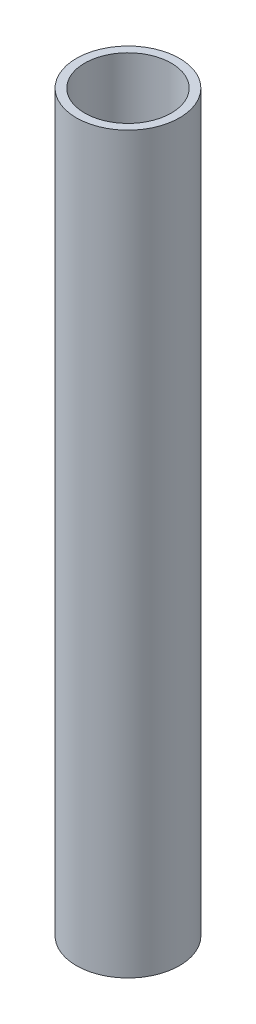
ISO-10303-21;
HEADER;
FILE_DESCRIPTION(('STEP AP214'),'2;1');
FILE_NAME('part.step','',(''),(''),'','','');
FILE_SCHEMA(('AUTOMOTIVE_DESIGN { 1 0 10303 214 1 1 1 1 }'));
ENDSEC;
DATA;
#1=APPLICATION_CONTEXT('core data for automotive mechanical design processes');
#2=APPLICATION_PROTOCOL_DEFINITION('international standard','automotive_design',2000,#1);
#3=PRODUCT_CONTEXT('',#1,'mechanical');
#4=PRODUCT('Part','Part','',(#3));
#5=PRODUCT_RELATED_PRODUCT_CATEGORY('part','',(#4));
#6=PRODUCT_DEFINITION_FORMATION('','',#4);
#7=PRODUCT_DEFINITION_CONTEXT('part definition',#1,'design');
#8=PRODUCT_DEFINITION('design','',#6,#7);
#9=PRODUCT_DEFINITION_SHAPE('','',#8);
#10=(LENGTH_UNIT() NAMED_UNIT(*) SI_UNIT(.MILLI.,.METRE.));
#11=(NAMED_UNIT(*) PLANE_ANGLE_UNIT() SI_UNIT($,.RADIAN.));
#12=(NAMED_UNIT(*) SI_UNIT($,.STERADIAN.) SOLID_ANGLE_UNIT());
#13=UNCERTAINTY_MEASURE_WITH_UNIT(LENGTH_MEASURE(1.E-05),#10,'distance_accuracy_value','');
#14=(GEOMETRIC_REPRESENTATION_CONTEXT(3) GLOBAL_UNCERTAINTY_ASSIGNED_CONTEXT((#13)) GLOBAL_UNIT_ASSIGNED_CONTEXT((#10,
#11,#12)) REPRESENTATION_CONTEXT('',''));
#15=CARTESIAN_POINT('',(0.,0.,0.));
#16=DIRECTION('',(0.,0.,1.));
#17=DIRECTION('',(1.,0.,0.));
#18=AXIS2_PLACEMENT_3D('',#15,#16,#17);
#19=CARTESIAN_POINT('',(0.,178.,0.));
#20=DIRECTION('',(0.,1.,0.));
#21=DIRECTION('',(0.,0.,1.));
#22=AXIS2_PLACEMENT_3D('',#19,#20,#21);
#23=PLANE('',#22);
#24=CARTESIAN_POINT('',(0.,178.,0.));
#25=DIRECTION('',(0.,1.,0.));
#26=DIRECTION('',(0.,0.,1.));
#27=AXIS2_PLACEMENT_3D('',#24,#25,#26);
#28=CIRCLE('',#27,12.5);
#29=CARTESIAN_POINT('',(0.,178.,12.5));
#30=VERTEX_POINT('',#29);
#31=EDGE_CURVE('E10',#30,#30,#28,.T.);
#32=ORIENTED_EDGE('',*,*,#31,.T.);
#33=EDGE_LOOP('',(#32));
#34=FACE_BOUND('',#33,.T.);
#35=CARTESIAN_POINT('',(0.,178.,0.));
#36=DIRECTION('',(0.,1.,0.));
#37=DIRECTION('',(0.,0.,1.));
#38=AXIS2_PLACEMENT_3D('',#35,#36,#37);
#39=CIRCLE('',#38,10.5);
#40=CARTESIAN_POINT('',(0.,178.,10.5));
#41=VERTEX_POINT('',#40);
#42=EDGE_CURVE('E42',#41,#41,#39,.T.);
#43=ORIENTED_EDGE('',*,*,#42,.F.);
#44=EDGE_LOOP('',(#43));
#45=FACE_BOUND('',#44,.T.);
#46=ADVANCED_FACE('F31',(#34,#45),#23,.T.);
#47=CARTESIAN_POINT('',(0.,0.,0.));
#48=DIRECTION('',(0.,1.,0.));
#49=DIRECTION('',(0.,0.,1.));
#50=AXIS2_PLACEMENT_3D('',#47,#48,#49);
#51=PLANE('',#50);
#52=CARTESIAN_POINT('',(0.,0.,0.));
#53=DIRECTION('',(0.,1.,0.));
#54=DIRECTION('',(0.,0.,1.));
#55=AXIS2_PLACEMENT_3D('',#52,#53,#54);
#56=CIRCLE('',#55,12.5);
#57=CARTESIAN_POINT('',(0.,0.,12.5));
#58=VERTEX_POINT('',#57);
#59=EDGE_CURVE('E35',#58,#58,#56,.T.);
#60=ORIENTED_EDGE('',*,*,#59,.F.);
#61=EDGE_LOOP('',(#60));
#62=FACE_BOUND('',#61,.T.);
#63=CARTESIAN_POINT('',(0.,0.,0.));
#64=DIRECTION('',(0.,1.,0.));
#65=DIRECTION('',(0.,0.,1.));
#66=AXIS2_PLACEMENT_3D('',#63,#64,#65);
#67=CIRCLE('',#66,10.5);
#68=CARTESIAN_POINT('',(0.,0.,10.5));
#69=VERTEX_POINT('',#68);
#70=EDGE_CURVE('E44',#69,#69,#67,.T.);
#71=ORIENTED_EDGE('',*,*,#70,.T.);
#72=EDGE_LOOP('',(#71));
#73=FACE_BOUND('',#72,.T.);
#74=ADVANCED_FACE('F54',(#62,#73),#51,.F.);
#75=CARTESIAN_POINT('',(0.,178.,0.));
#76=DIRECTION('',(0.,-1.,0.));
#77=DIRECTION('',(0.,0.,-1.));
#78=AXIS2_PLACEMENT_3D('',#75,#76,#77);
#79=CYLINDRICAL_SURFACE('',#78,12.5);
#80=ORIENTED_EDGE('',*,*,#31,.F.);
#81=EDGE_LOOP('',(#80));
#82=FACE_BOUND('',#81,.T.);
#83=ORIENTED_EDGE('',*,*,#59,.T.);
#84=EDGE_LOOP('',(#83));
#85=FACE_BOUND('',#84,.T.);
#86=ADVANCED_FACE('F33',(#82,#85),#79,.T.);
#87=CARTESIAN_POINT('',(0.,178.,0.));
#88=DIRECTION('',(0.,-1.,0.));
#89=DIRECTION('',(0.,0.,-1.));
#90=AXIS2_PLACEMENT_3D('',#87,#88,#89);
#91=CYLINDRICAL_SURFACE('',#90,10.5);
#92=ORIENTED_EDGE('',*,*,#42,.T.);
#93=EDGE_LOOP('',(#92));
#94=FACE_BOUND('',#93,.T.);
#95=ORIENTED_EDGE('',*,*,#70,.F.);
#96=EDGE_LOOP('',(#95));
#97=FACE_BOUND('',#96,.T.);
#98=ADVANCED_FACE('F50',(#94,#97),#91,.F.);
#99=CLOSED_SHELL('',(#46,#74,#86,#98));
#100=MANIFOLD_SOLID_BREP('B2',#99);
#101=ADVANCED_BREP_SHAPE_REPRESENTATION('',(#18,#100),#14);
#102=SHAPE_DEFINITION_REPRESENTATION(#9,#101);
ENDSEC;
END-ISO-10303-21;
